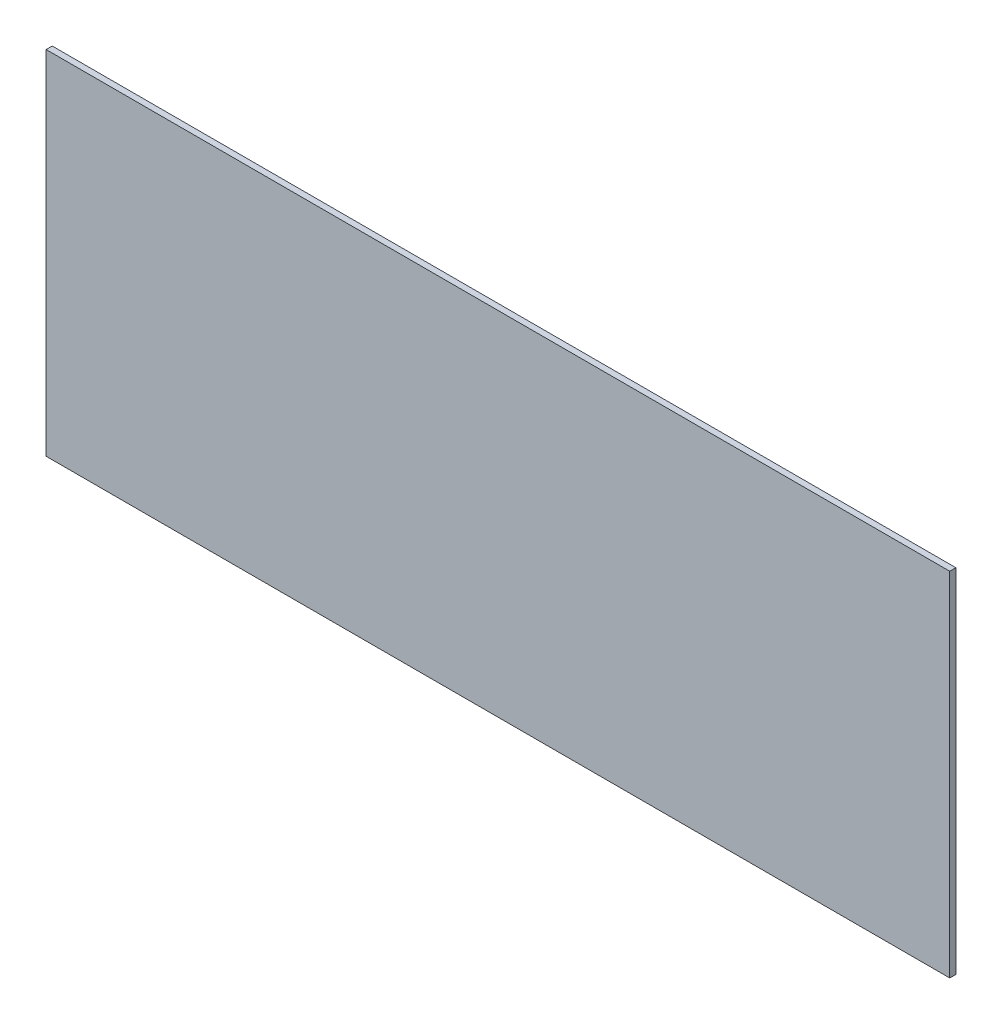
ISO-10303-21;
HEADER;
FILE_DESCRIPTION(('STEP AP214'),'2;1');
FILE_NAME('part.step','',(''),(''),'','','');
FILE_SCHEMA(('AUTOMOTIVE_DESIGN { 1 0 10303 214 1 1 1 1 }'));
ENDSEC;
DATA;
#1=APPLICATION_CONTEXT('core data for automotive mechanical design processes');
#2=APPLICATION_PROTOCOL_DEFINITION('international standard','automotive_design',2000,#1);
#3=PRODUCT_CONTEXT('',#1,'mechanical');
#4=PRODUCT('Part','Part','',(#3));
#5=PRODUCT_RELATED_PRODUCT_CATEGORY('part','',(#4));
#6=PRODUCT_DEFINITION_FORMATION('','',#4);
#7=PRODUCT_DEFINITION_CONTEXT('part definition',#1,'design');
#8=PRODUCT_DEFINITION('design','',#6,#7);
#9=PRODUCT_DEFINITION_SHAPE('','',#8);
#10=(LENGTH_UNIT() NAMED_UNIT(*) SI_UNIT(.MILLI.,.METRE.));
#11=(NAMED_UNIT(*) PLANE_ANGLE_UNIT() SI_UNIT($,.RADIAN.));
#12=(NAMED_UNIT(*) SI_UNIT($,.STERADIAN.) SOLID_ANGLE_UNIT());
#13=UNCERTAINTY_MEASURE_WITH_UNIT(LENGTH_MEASURE(1.E-05),#10,'distance_accuracy_value','');
#14=(GEOMETRIC_REPRESENTATION_CONTEXT(3) GLOBAL_UNCERTAINTY_ASSIGNED_CONTEXT((#13)) GLOBAL_UNIT_ASSIGNED_CONTEXT((#10,
#11,#12)) REPRESENTATION_CONTEXT('',''));
#15=CARTESIAN_POINT('',(0.,0.,0.));
#16=DIRECTION('',(0.,0.,1.));
#17=DIRECTION('',(1.,0.,0.));
#18=AXIS2_PLACEMENT_3D('',#15,#16,#17);
#19=CARTESIAN_POINT('',(25.,25.,38.));
#20=DIRECTION('',(1.,0.,0.));
#21=DIRECTION('',(0.,0.,-1.));
#22=AXIS2_PLACEMENT_3D('',#19,#20,#21);
#23=PLANE('',#22);
#24=DIRECTION('',(0.,-1.,0.));
#25=VECTOR('',#24,1.);
#26=CARTESIAN_POINT('',(25.,25.,34.));
#27=LINE('',#26,#25);
#28=CARTESIAN_POINT('',(25.,255.,34.));
#29=VERTEX_POINT('',#28);
#30=CARTESIAN_POINT('',(25.,25.,34.));
#31=VERTEX_POINT('',#30);
#32=EDGE_CURVE('E102',#29,#31,#27,.T.);
#33=ORIENTED_EDGE('',*,*,#32,.T.);
#34=DIRECTION('',(0.,0.,-1.));
#35=VECTOR('',#34,1.);
#36=CARTESIAN_POINT('',(25.,25.,38.));
#37=LINE('',#36,#35);
#38=CARTESIAN_POINT('',(25.,25.,38.));
#39=VERTEX_POINT('',#38);
#40=EDGE_CURVE('E11',#39,#31,#37,.T.);
#41=ORIENTED_EDGE('',*,*,#40,.F.);
#42=DIRECTION('',(0.,-1.,0.));
#43=VECTOR('',#42,1.);
#44=CARTESIAN_POINT('',(25.,25.,38.));
#45=LINE('',#44,#43);
#46=CARTESIAN_POINT('',(25.,255.,38.));
#47=VERTEX_POINT('',#46);
#48=EDGE_CURVE('E90',#47,#39,#45,.T.);
#49=ORIENTED_EDGE('',*,*,#48,.F.);
#50=DIRECTION('',(0.,0.,-1.));
#51=VECTOR('',#50,1.);
#52=CARTESIAN_POINT('',(25.,255.,38.));
#53=LINE('',#52,#51);
#54=EDGE_CURVE('E98',#47,#29,#53,.T.);
#55=ORIENTED_EDGE('',*,*,#54,.T.);
#56=EDGE_LOOP('',(#33,#41,#49,#55));
#57=FACE_BOUND('',#56,.T.);
#58=ADVANCED_FACE('F39',(#57),#23,.F.);
#59=CARTESIAN_POINT('',(25.,25.,38.));
#60=DIRECTION('',(0.,1.,0.));
#61=DIRECTION('',(0.,0.,1.));
#62=AXIS2_PLACEMENT_3D('',#59,#60,#61);
#63=PLANE('',#62);
#64=DIRECTION('',(1.,0.,0.));
#65=VECTOR('',#64,1.);
#66=CARTESIAN_POINT('',(25.,25.,34.));
#67=LINE('',#66,#65);
#68=CARTESIAN_POINT('',(615.,25.,34.));
#69=VERTEX_POINT('',#68);
#70=EDGE_CURVE('E94',#31,#69,#67,.T.);
#71=ORIENTED_EDGE('',*,*,#70,.T.);
#72=DIRECTION('',(0.,0.,-1.));
#73=VECTOR('',#72,1.);
#74=CARTESIAN_POINT('',(615.,25.,38.));
#75=LINE('',#74,#73);
#76=CARTESIAN_POINT('',(615.,25.,38.));
#77=VERTEX_POINT('',#76);
#78=EDGE_CURVE('E47',#77,#69,#75,.T.);
#79=ORIENTED_EDGE('',*,*,#78,.F.);
#80=DIRECTION('',(1.,0.,0.));
#81=VECTOR('',#80,1.);
#82=CARTESIAN_POINT('',(25.,25.,38.));
#83=LINE('',#82,#81);
#84=EDGE_CURVE('E85',#39,#77,#83,.T.);
#85=ORIENTED_EDGE('',*,*,#84,.F.);
#86=ORIENTED_EDGE('',*,*,#40,.T.);
#87=EDGE_LOOP('',(#71,#79,#85,#86));
#88=FACE_BOUND('',#87,.T.);
#89=ADVANCED_FACE('F93',(#88),#63,.F.);
#90=CARTESIAN_POINT('',(615.,25.,38.));
#91=DIRECTION('',(-1.,0.,0.));
#92=DIRECTION('',(0.,0.,1.));
#93=AXIS2_PLACEMENT_3D('',#90,#91,#92);
#94=PLANE('',#93);
#95=DIRECTION('',(0.,1.,0.));
#96=VECTOR('',#95,1.);
#97=CARTESIAN_POINT('',(615.,25.,34.));
#98=LINE('',#97,#96);
#99=CARTESIAN_POINT('',(615.,255.,34.));
#100=VERTEX_POINT('',#99);
#101=EDGE_CURVE('E72',#69,#100,#98,.T.);
#102=ORIENTED_EDGE('',*,*,#101,.T.);
#103=DIRECTION('',(0.,0.,-1.));
#104=VECTOR('',#103,1.);
#105=CARTESIAN_POINT('',(615.,255.,38.));
#106=LINE('',#105,#104);
#107=CARTESIAN_POINT('',(615.,255.,38.));
#108=VERTEX_POINT('',#107);
#109=EDGE_CURVE('E95',#108,#100,#106,.T.);
#110=ORIENTED_EDGE('',*,*,#109,.F.);
#111=DIRECTION('',(0.,1.,0.));
#112=VECTOR('',#111,1.);
#113=CARTESIAN_POINT('',(615.,25.,38.));
#114=LINE('',#113,#112);
#115=EDGE_CURVE('E88',#77,#108,#114,.T.);
#116=ORIENTED_EDGE('',*,*,#115,.F.);
#117=ORIENTED_EDGE('',*,*,#78,.T.);
#118=EDGE_LOOP('',(#102,#110,#116,#117));
#119=FACE_BOUND('',#118,.T.);
#120=ADVANCED_FACE('F96',(#119),#94,.F.);
#121=CARTESIAN_POINT('',(25.,255.,38.));
#122=DIRECTION('',(0.,-1.,0.));
#123=DIRECTION('',(0.,0.,-1.));
#124=AXIS2_PLACEMENT_3D('',#121,#122,#123);
#125=PLANE('',#124);
#126=DIRECTION('',(-1.,0.,0.));
#127=VECTOR('',#126,1.);
#128=CARTESIAN_POINT('',(25.,255.,34.));
#129=LINE('',#128,#127);
#130=EDGE_CURVE('E78',#100,#29,#129,.T.);
#131=ORIENTED_EDGE('',*,*,#130,.T.);
#132=ORIENTED_EDGE('',*,*,#54,.F.);
#133=DIRECTION('',(-1.,0.,0.));
#134=VECTOR('',#133,1.);
#135=CARTESIAN_POINT('',(25.,255.,38.));
#136=LINE('',#135,#134);
#137=EDGE_CURVE('E55',#108,#47,#136,.T.);
#138=ORIENTED_EDGE('',*,*,#137,.F.);
#139=ORIENTED_EDGE('',*,*,#109,.T.);
#140=EDGE_LOOP('',(#131,#132,#138,#139));
#141=FACE_BOUND('',#140,.T.);
#142=ADVANCED_FACE('F109',(#141),#125,.F.);
#143=CARTESIAN_POINT('',(0.,0.,38.));
#144=DIRECTION('',(0.,0.,-1.));
#145=DIRECTION('',(-1.,0.,0.));
#146=AXIS2_PLACEMENT_3D('',#143,#144,#145);
#147=PLANE('',#146);
#148=ORIENTED_EDGE('',*,*,#48,.T.);
#149=ORIENTED_EDGE('',*,*,#84,.T.);
#150=ORIENTED_EDGE('',*,*,#115,.T.);
#151=ORIENTED_EDGE('',*,*,#137,.T.);
#152=EDGE_LOOP('',(#148,#149,#150,#151));
#153=FACE_BOUND('',#152,.T.);
#154=ADVANCED_FACE('F86',(#153),#147,.F.);
#155=CARTESIAN_POINT('',(0.,0.,34.));
#156=DIRECTION('',(0.,0.,-1.));
#157=DIRECTION('',(-1.,0.,0.));
#158=AXIS2_PLACEMENT_3D('',#155,#156,#157);
#159=PLANE('',#158);
#160=ORIENTED_EDGE('',*,*,#32,.F.);
#161=ORIENTED_EDGE('',*,*,#130,.F.);
#162=ORIENTED_EDGE('',*,*,#101,.F.);
#163=ORIENTED_EDGE('',*,*,#70,.F.);
#164=EDGE_LOOP('',(#160,#161,#162,#163));
#165=FACE_BOUND('',#164,.T.);
#166=ADVANCED_FACE('F112',(#165),#159,.T.);
#167=CLOSED_SHELL('',(#58,#89,#120,#142,#154,#166));
#168=MANIFOLD_SOLID_BREP('B2',#167);
#169=ADVANCED_BREP_SHAPE_REPRESENTATION('',(#18,#168),#14);
#170=SHAPE_DEFINITION_REPRESENTATION(#9,#169);
ENDSEC;
END-ISO-10303-21;
